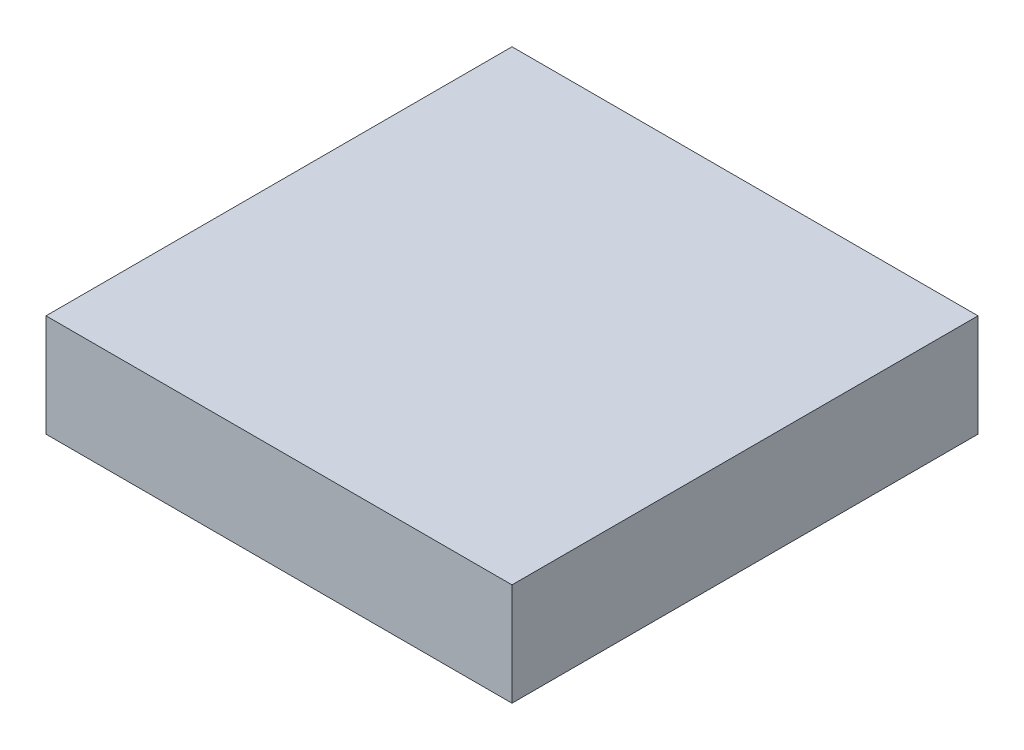
ISO-10303-21;
HEADER;
FILE_DESCRIPTION(('STEP AP214'),'2;1');
FILE_NAME('part.step','',(''),(''),'','','');
FILE_SCHEMA(('AUTOMOTIVE_DESIGN { 1 0 10303 214 1 1 1 1 }'));
ENDSEC;
DATA;
#1=APPLICATION_CONTEXT('core data for automotive mechanical design processes');
#2=APPLICATION_PROTOCOL_DEFINITION('international standard','automotive_design',2000,#1);
#3=PRODUCT_CONTEXT('',#1,'mechanical');
#4=PRODUCT('Part','Part','',(#3));
#5=PRODUCT_RELATED_PRODUCT_CATEGORY('part','',(#4));
#6=PRODUCT_DEFINITION_FORMATION('','',#4);
#7=PRODUCT_DEFINITION_CONTEXT('part definition',#1,'design');
#8=PRODUCT_DEFINITION('design','',#6,#7);
#9=PRODUCT_DEFINITION_SHAPE('','',#8);
#10=(LENGTH_UNIT() NAMED_UNIT(*) SI_UNIT(.MILLI.,.METRE.));
#11=(NAMED_UNIT(*) PLANE_ANGLE_UNIT() SI_UNIT($,.RADIAN.));
#12=(NAMED_UNIT(*) SI_UNIT($,.STERADIAN.) SOLID_ANGLE_UNIT());
#13=UNCERTAINTY_MEASURE_WITH_UNIT(LENGTH_MEASURE(1.E-05),#10,'distance_accuracy_value','');
#14=(GEOMETRIC_REPRESENTATION_CONTEXT(3) GLOBAL_UNCERTAINTY_ASSIGNED_CONTEXT((#13)) GLOBAL_UNIT_ASSIGNED_CONTEXT((#10,
#11,#12)) REPRESENTATION_CONTEXT('',''));
#15=CARTESIAN_POINT('',(0.,0.,0.));
#16=DIRECTION('',(0.,0.,1.));
#17=DIRECTION('',(1.,0.,0.));
#18=AXIS2_PLACEMENT_3D('',#15,#16,#17);
#19=CARTESIAN_POINT('',(12.7,5.588,12.7));
#20=DIRECTION('',(-1.,0.,0.));
#21=DIRECTION('',(0.,0.,1.));
#22=AXIS2_PLACEMENT_3D('',#19,#20,#21);
#23=PLANE('',#22);
#24=DIRECTION('',(0.,0.,-1.));
#25=VECTOR('',#24,1.);
#26=CARTESIAN_POINT('',(12.7,0.,12.7));
#27=LINE('',#26,#25);
#28=CARTESIAN_POINT('',(12.7,0.,12.7));
#29=VERTEX_POINT('',#28);
#30=CARTESIAN_POINT('',(12.7,0.,-12.7));
#31=VERTEX_POINT('',#30);
#32=EDGE_CURVE('E107',#29,#31,#27,.T.);
#33=ORIENTED_EDGE('',*,*,#32,.T.);
#34=DIRECTION('',(0.,-1.,0.));
#35=VECTOR('',#34,1.);
#36=CARTESIAN_POINT('',(12.7,5.588,-12.7));
#37=LINE('',#36,#35);
#38=CARTESIAN_POINT('',(12.7,5.588,-12.7));
#39=VERTEX_POINT('',#38);
#40=EDGE_CURVE('E11',#39,#31,#37,.T.);
#41=ORIENTED_EDGE('',*,*,#40,.F.);
#42=DIRECTION('',(0.,0.,-1.));
#43=VECTOR('',#42,1.);
#44=CARTESIAN_POINT('',(12.7,5.588,12.7));
#45=LINE('',#44,#43);
#46=CARTESIAN_POINT('',(12.7,5.588,12.7));
#47=VERTEX_POINT('',#46);
#48=EDGE_CURVE('E91',#47,#39,#45,.T.);
#49=ORIENTED_EDGE('',*,*,#48,.F.);
#50=DIRECTION('',(0.,-1.,0.));
#51=VECTOR('',#50,1.);
#52=CARTESIAN_POINT('',(12.7,5.588,12.7));
#53=LINE('',#52,#51);
#54=EDGE_CURVE('E103',#47,#29,#53,.T.);
#55=ORIENTED_EDGE('',*,*,#54,.T.);
#56=EDGE_LOOP('',(#33,#41,#49,#55));
#57=FACE_BOUND('',#56,.T.);
#58=ADVANCED_FACE('F39',(#57),#23,.F.);
#59=CARTESIAN_POINT('',(-12.7,5.588,-12.7));
#60=DIRECTION('',(0.,0.,1.));
#61=DIRECTION('',(1.,0.,0.));
#62=AXIS2_PLACEMENT_3D('',#59,#60,#61);
#63=PLANE('',#62);
#64=DIRECTION('',(-1.,0.,0.));
#65=VECTOR('',#64,1.);
#66=CARTESIAN_POINT('',(-12.7,0.,-12.7));
#67=LINE('',#66,#65);
#68=CARTESIAN_POINT('',(-12.7,0.,-12.7));
#69=VERTEX_POINT('',#68);
#70=EDGE_CURVE('E96',#31,#69,#67,.T.);
#71=ORIENTED_EDGE('',*,*,#70,.T.);
#72=DIRECTION('',(0.,-1.,0.));
#73=VECTOR('',#72,1.);
#74=CARTESIAN_POINT('',(-12.7,5.588,-12.7));
#75=LINE('',#74,#73);
#76=CARTESIAN_POINT('',(-12.7,5.588,-12.7));
#77=VERTEX_POINT('',#76);
#78=EDGE_CURVE('E48',#77,#69,#75,.T.);
#79=ORIENTED_EDGE('',*,*,#78,.F.);
#80=DIRECTION('',(-1.,0.,0.));
#81=VECTOR('',#80,1.);
#82=CARTESIAN_POINT('',(-12.7,5.588,-12.7));
#83=LINE('',#82,#81);
#84=EDGE_CURVE('E86',#39,#77,#83,.T.);
#85=ORIENTED_EDGE('',*,*,#84,.F.);
#86=ORIENTED_EDGE('',*,*,#40,.T.);
#87=EDGE_LOOP('',(#71,#79,#85,#86));
#88=FACE_BOUND('',#87,.T.);
#89=ADVANCED_FACE('F95',(#88),#63,.F.);
#90=CARTESIAN_POINT('',(-12.7,5.588,12.7));
#91=DIRECTION('',(1.,0.,0.));
#92=DIRECTION('',(0.,0.,-1.));
#93=AXIS2_PLACEMENT_3D('',#90,#91,#92);
#94=PLANE('',#93);
#95=DIRECTION('',(0.,0.,1.));
#96=VECTOR('',#95,1.);
#97=CARTESIAN_POINT('',(-12.7,0.,12.7));
#98=LINE('',#97,#96);
#99=CARTESIAN_POINT('',(-12.7,0.,12.7));
#100=VERTEX_POINT('',#99);
#101=EDGE_CURVE('E73',#69,#100,#98,.T.);
#102=ORIENTED_EDGE('',*,*,#101,.T.);
#103=DIRECTION('',(0.,-1.,0.));
#104=VECTOR('',#103,1.);
#105=CARTESIAN_POINT('',(-12.7,5.588,12.7));
#106=LINE('',#105,#104);
#107=CARTESIAN_POINT('',(-12.7,5.588,12.7));
#108=VERTEX_POINT('',#107);
#109=EDGE_CURVE('E98',#108,#100,#106,.T.);
#110=ORIENTED_EDGE('',*,*,#109,.F.);
#111=DIRECTION('',(0.,0.,1.));
#112=VECTOR('',#111,1.);
#113=CARTESIAN_POINT('',(-12.7,5.588,12.7));
#114=LINE('',#113,#112);
#115=EDGE_CURVE('E89',#77,#108,#114,.T.);
#116=ORIENTED_EDGE('',*,*,#115,.F.);
#117=ORIENTED_EDGE('',*,*,#78,.T.);
#118=EDGE_LOOP('',(#102,#110,#116,#117));
#119=FACE_BOUND('',#118,.T.);
#120=ADVANCED_FACE('F99',(#119),#94,.F.);
#121=CARTESIAN_POINT('',(-12.7,5.588,12.7));
#122=DIRECTION('',(0.,0.,-1.));
#123=DIRECTION('',(-1.,0.,0.));
#124=AXIS2_PLACEMENT_3D('',#121,#122,#123);
#125=PLANE('',#124);
#126=DIRECTION('',(1.,0.,0.));
#127=VECTOR('',#126,1.);
#128=CARTESIAN_POINT('',(-12.7,0.,12.7));
#129=LINE('',#128,#127);
#130=EDGE_CURVE('E79',#100,#29,#129,.T.);
#131=ORIENTED_EDGE('',*,*,#130,.T.);
#132=ORIENTED_EDGE('',*,*,#54,.F.);
#133=DIRECTION('',(1.,0.,0.));
#134=VECTOR('',#133,1.);
#135=CARTESIAN_POINT('',(-12.7,5.588,12.7));
#136=LINE('',#135,#134);
#137=EDGE_CURVE('E56',#108,#47,#136,.T.);
#138=ORIENTED_EDGE('',*,*,#137,.F.);
#139=ORIENTED_EDGE('',*,*,#109,.T.);
#140=EDGE_LOOP('',(#131,#132,#138,#139));
#141=FACE_BOUND('',#140,.T.);
#142=ADVANCED_FACE('F120',(#141),#125,.F.);
#143=CARTESIAN_POINT('',(0.,5.588,0.));
#144=DIRECTION('',(0.,-1.,0.));
#145=DIRECTION('',(0.,0.,-1.));
#146=AXIS2_PLACEMENT_3D('',#143,#144,#145);
#147=PLANE('',#146);
#148=ORIENTED_EDGE('',*,*,#48,.T.);
#149=ORIENTED_EDGE('',*,*,#84,.T.);
#150=ORIENTED_EDGE('',*,*,#115,.T.);
#151=ORIENTED_EDGE('',*,*,#137,.T.);
#152=EDGE_LOOP('',(#148,#149,#150,#151));
#153=FACE_BOUND('',#152,.T.);
#154=ADVANCED_FACE('F87',(#153),#147,.F.);
#155=CARTESIAN_POINT('',(0.,0.,0.));
#156=DIRECTION('',(0.,-1.,0.));
#157=DIRECTION('',(0.,0.,-1.));
#158=AXIS2_PLACEMENT_3D('',#155,#156,#157);
#159=PLANE('',#158);
#160=ORIENTED_EDGE('',*,*,#32,.F.);
#161=ORIENTED_EDGE('',*,*,#130,.F.);
#162=ORIENTED_EDGE('',*,*,#101,.F.);
#163=ORIENTED_EDGE('',*,*,#70,.F.);
#164=EDGE_LOOP('',(#160,#161,#162,#163));
#165=FACE_BOUND('',#164,.T.);
#166=ADVANCED_FACE('F123',(#165),#159,.T.);
#167=CLOSED_SHELL('',(#58,#89,#120,#142,#154,#166));
#168=MANIFOLD_SOLID_BREP('B2',#167);
#169=ADVANCED_BREP_SHAPE_REPRESENTATION('',(#18,#168),#14);
#170=SHAPE_DEFINITION_REPRESENTATION(#9,#169);
ENDSEC;
END-ISO-10303-21;
